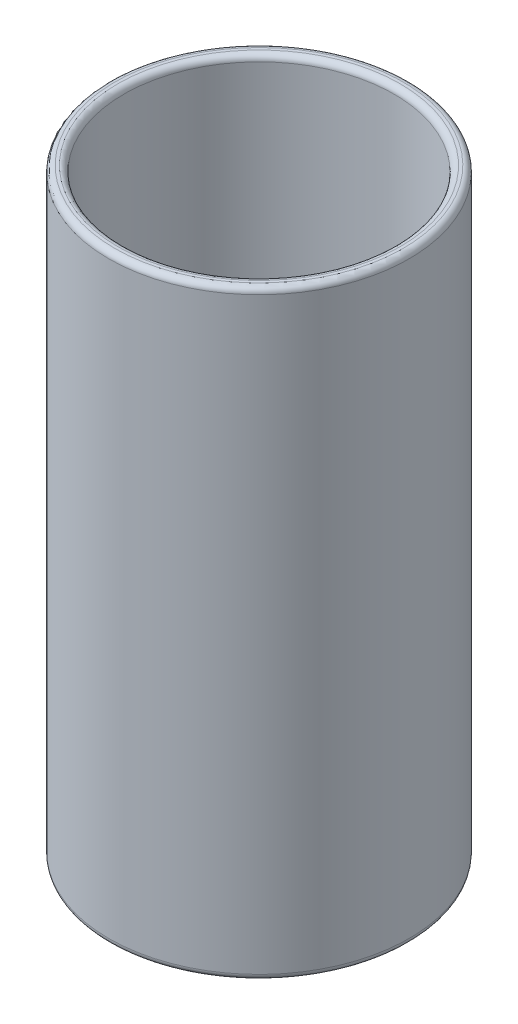
ISO-10303-21;
HEADER;
FILE_DESCRIPTION(('STEP AP214'),'2;1');
FILE_NAME('part.step','',(''),(''),'','','');
FILE_SCHEMA(('AUTOMOTIVE_DESIGN { 1 0 10303 214 1 1 1 1 }'));
ENDSEC;
DATA;
#1=APPLICATION_CONTEXT('core data for automotive mechanical design processes');
#2=APPLICATION_PROTOCOL_DEFINITION('international standard','automotive_design',2000,#1);
#3=PRODUCT_CONTEXT('',#1,'mechanical');
#4=PRODUCT('Part','Part','',(#3));
#5=PRODUCT_RELATED_PRODUCT_CATEGORY('part','',(#4));
#6=PRODUCT_DEFINITION_FORMATION('','',#4);
#7=PRODUCT_DEFINITION_CONTEXT('part definition',#1,'design');
#8=PRODUCT_DEFINITION('design','',#6,#7);
#9=PRODUCT_DEFINITION_SHAPE('','',#8);
#10=(LENGTH_UNIT() NAMED_UNIT(*) SI_UNIT(.MILLI.,.METRE.));
#11=(NAMED_UNIT(*) PLANE_ANGLE_UNIT() SI_UNIT($,.RADIAN.));
#12=(NAMED_UNIT(*) SI_UNIT($,.STERADIAN.) SOLID_ANGLE_UNIT());
#13=UNCERTAINTY_MEASURE_WITH_UNIT(LENGTH_MEASURE(1.E-05),#10,'distance_accuracy_value','');
#14=(GEOMETRIC_REPRESENTATION_CONTEXT(3) GLOBAL_UNCERTAINTY_ASSIGNED_CONTEXT((#13)) GLOBAL_UNIT_ASSIGNED_CONTEXT((#10,
#11,#12)) REPRESENTATION_CONTEXT('',''));
#15=CARTESIAN_POINT('',(0.,0.,0.));
#16=DIRECTION('',(0.,0.,1.));
#17=DIRECTION('',(1.,0.,0.));
#18=AXIS2_PLACEMENT_3D('',#15,#16,#17);
#19=CARTESIAN_POINT('',(0.,-34.7034708174048,0.));
#20=DIRECTION('',(0.,1.,0.));
#21=DIRECTION('',(0.,0.,1.));
#22=AXIS2_PLACEMENT_3D('',#19,#20,#21);
#23=PLANE('',#22);
#24=CARTESIAN_POINT('',(0.,-34.7034708174048,0.));
#25=DIRECTION('',(0.,1.,0.));
#26=DIRECTION('',(0.,0.,1.));
#27=AXIS2_PLACEMENT_3D('',#24,#25,#26);
#28=CIRCLE('',#27,47.);
#29=CARTESIAN_POINT('',(0.,-34.7034708174048,47.));
#30=VERTEX_POINT('',#29);
#31=EDGE_CURVE('E48',#30,#30,#28,.F.);
#32=ORIENTED_EDGE('',*,*,#31,.T.);
#33=EDGE_LOOP('',(#32));
#34=FACE_BOUND('',#33,.T.);
#35=CARTESIAN_POINT('',(0.,-34.7034708174048,0.));
#36=DIRECTION('',(0.,1.,0.));
#37=DIRECTION('',(0.,0.,1.));
#38=AXIS2_PLACEMENT_3D('',#35,#36,#37);
#39=CIRCLE('',#38,48.);
#40=CARTESIAN_POINT('',(0.,-34.7034708174048,48.));
#41=VERTEX_POINT('',#40);
#42=EDGE_CURVE('E53',#41,#41,#39,.T.);
#43=ORIENTED_EDGE('',*,*,#42,.T.);
#44=EDGE_LOOP('',(#43));
#45=FACE_BOUND('',#44,.T.);
#46=ADVANCED_FACE('F33',(#34,#45),#23,.T.);
#47=CARTESIAN_POINT('',(0.,0.,0.));
#48=DIRECTION('',(0.,1.,0.));
#49=DIRECTION('',(0.,0.,1.));
#50=AXIS2_PLACEMENT_3D('',#47,#48,#49);
#51=CYLINDRICAL_SURFACE('',#50,50.);
#52=CARTESIAN_POINT('',(0.,-232.703470817405,0.));
#53=DIRECTION('',(0.,-1.,0.));
#54=DIRECTION('',(0.,0.,-1.));
#55=AXIS2_PLACEMENT_3D('',#52,#53,#54);
#56=CIRCLE('',#55,50.);
#57=CARTESIAN_POINT('',(0.,-232.703470817405,-50.));
#58=VERTEX_POINT('',#57);
#59=EDGE_CURVE('E40',#58,#58,#56,.F.);
#60=ORIENTED_EDGE('',*,*,#59,.T.);
#61=EDGE_LOOP('',(#60));
#62=FACE_BOUND('',#61,.T.);
#63=CARTESIAN_POINT('',(0.,-36.7034708174048,0.));
#64=DIRECTION('',(0.,1.,0.));
#65=DIRECTION('',(0.,0.,1.));
#66=AXIS2_PLACEMENT_3D('',#63,#64,#65);
#67=CIRCLE('',#66,50.);
#68=CARTESIAN_POINT('',(0.,-36.7034708174048,50.));
#69=VERTEX_POINT('',#68);
#70=EDGE_CURVE('E44',#69,#69,#67,.F.);
#71=ORIENTED_EDGE('',*,*,#70,.T.);
#72=EDGE_LOOP('',(#71));
#73=FACE_BOUND('',#72,.T.);
#74=ADVANCED_FACE('F76',(#62,#73),#51,.T.);
#75=CARTESIAN_POINT('',(-50.,-234.703470817405,0.));
#76=DIRECTION('',(0.,-1.,0.));
#77=DIRECTION('',(0.,0.,-1.));
#78=AXIS2_PLACEMENT_3D('',#75,#76,#77);
#79=PLANE('',#78);
#80=CARTESIAN_POINT('',(0.,-234.703470817405,0.));
#81=DIRECTION('',(0.,-1.,0.));
#82=DIRECTION('',(0.,0.,-1.));
#83=AXIS2_PLACEMENT_3D('',#80,#81,#82);
#84=CIRCLE('',#83,48.);
#85=CARTESIAN_POINT('',(0.,-234.703470817405,-48.));
#86=VERTEX_POINT('',#85);
#87=EDGE_CURVE('E10',#86,#86,#84,.T.);
#88=ORIENTED_EDGE('',*,*,#87,.T.);
#89=EDGE_LOOP('',(#88));
#90=FACE_BOUND('',#89,.T.);
#91=ADVANCED_FACE('F67',(#90),#79,.T.);
#92=CARTESIAN_POINT('',(0.,-229.703470817405,0.));
#93=DIRECTION('',(0.,1.,0.));
#94=DIRECTION('',(0.,0.,1.));
#95=AXIS2_PLACEMENT_3D('',#92,#93,#94);
#96=CYLINDRICAL_SURFACE('',#95,45.);
#97=CARTESIAN_POINT('',(0.,-36.7034708174048,0.));
#98=DIRECTION('',(0.,1.,0.));
#99=DIRECTION('',(0.,0.,1.));
#100=AXIS2_PLACEMENT_3D('',#97,#98,#99);
#101=CIRCLE('',#100,45.);
#102=CARTESIAN_POINT('',(0.,-36.7034708174048,45.));
#103=VERTEX_POINT('',#102);
#104=EDGE_CURVE('E56',#103,#103,#101,.T.);
#105=ORIENTED_EDGE('',*,*,#104,.T.);
#106=EDGE_LOOP('',(#105));
#107=FACE_BOUND('',#106,.T.);
#108=CARTESIAN_POINT('',(0.,-229.703470817405,0.));
#109=DIRECTION('',(0.,1.,0.));
#110=DIRECTION('',(0.,0.,1.));
#111=AXIS2_PLACEMENT_3D('',#108,#109,#110);
#112=CIRCLE('',#111,45.);
#113=CARTESIAN_POINT('',(0.,-229.703470817405,45.));
#114=VERTEX_POINT('',#113);
#115=EDGE_CURVE('E59',#114,#114,#112,.T.);
#116=ORIENTED_EDGE('',*,*,#115,.F.);
#117=EDGE_LOOP('',(#116));
#118=FACE_BOUND('',#117,.T.);
#119=ADVANCED_FACE('F65',(#107,#118),#96,.F.);
#120=CARTESIAN_POINT('',(0.,-229.703470817405,0.));
#121=DIRECTION('',(0.,1.,0.));
#122=DIRECTION('',(0.,0.,1.));
#123=AXIS2_PLACEMENT_3D('',#120,#121,#122);
#124=PLANE('',#123);
#125=ORIENTED_EDGE('',*,*,#115,.T.);
#126=EDGE_LOOP('',(#125));
#127=FACE_BOUND('',#126,.T.);
#128=ADVANCED_FACE('F63',(#127),#124,.T.);
#129=CARTESIAN_POINT('',(0.,-36.7034708174048,0.));
#130=DIRECTION('',(0.,1.,0.));
#131=DIRECTION('',(0.,0.,1.));
#132=AXIS2_PLACEMENT_3D('',#129,#130,#131);
#133=TOROIDAL_SURFACE('',#132,47.,2.);
#134=ORIENTED_EDGE('',*,*,#31,.F.);
#135=EDGE_LOOP('',(#134));
#136=FACE_BOUND('',#135,.T.);
#137=ORIENTED_EDGE('',*,*,#104,.F.);
#138=EDGE_LOOP('',(#137));
#139=FACE_BOUND('',#138,.T.);
#140=ADVANCED_FACE('F74',(#136,#139),#133,.T.);
#141=CARTESIAN_POINT('',(0.,-36.7034708174048,0.));
#142=DIRECTION('',(0.,1.,0.));
#143=DIRECTION('',(0.,0.,1.));
#144=AXIS2_PLACEMENT_3D('',#141,#142,#143);
#145=TOROIDAL_SURFACE('',#144,48.,2.);
#146=ORIENTED_EDGE('',*,*,#70,.F.);
#147=EDGE_LOOP('',(#146));
#148=FACE_BOUND('',#147,.T.);
#149=ORIENTED_EDGE('',*,*,#42,.F.);
#150=EDGE_LOOP('',(#149));
#151=FACE_BOUND('',#150,.T.);
#152=ADVANCED_FACE('F88',(#148,#151),#145,.T.);
#153=CARTESIAN_POINT('',(0.,-232.703470817405,0.));
#154=DIRECTION('',(0.,-1.,0.));
#155=DIRECTION('',(0.,0.,-1.));
#156=AXIS2_PLACEMENT_3D('',#153,#154,#155);
#157=TOROIDAL_SURFACE('',#156,48.,2.);
#158=ORIENTED_EDGE('',*,*,#87,.F.);
#159=EDGE_LOOP('',(#158));
#160=FACE_BOUND('',#159,.T.);
#161=ORIENTED_EDGE('',*,*,#59,.F.);
#162=EDGE_LOOP('',(#161));
#163=FACE_BOUND('',#162,.T.);
#164=ADVANCED_FACE('F35',(#160,#163),#157,.T.);
#165=CLOSED_SHELL('',(#46,#74,#91,#119,#128,#140,#152,#164));
#166=MANIFOLD_SOLID_BREP('B2',#165);
#167=ADVANCED_BREP_SHAPE_REPRESENTATION('',(#18,#166),#14);
#168=SHAPE_DEFINITION_REPRESENTATION(#9,#167);
ENDSEC;
END-ISO-10303-21;
